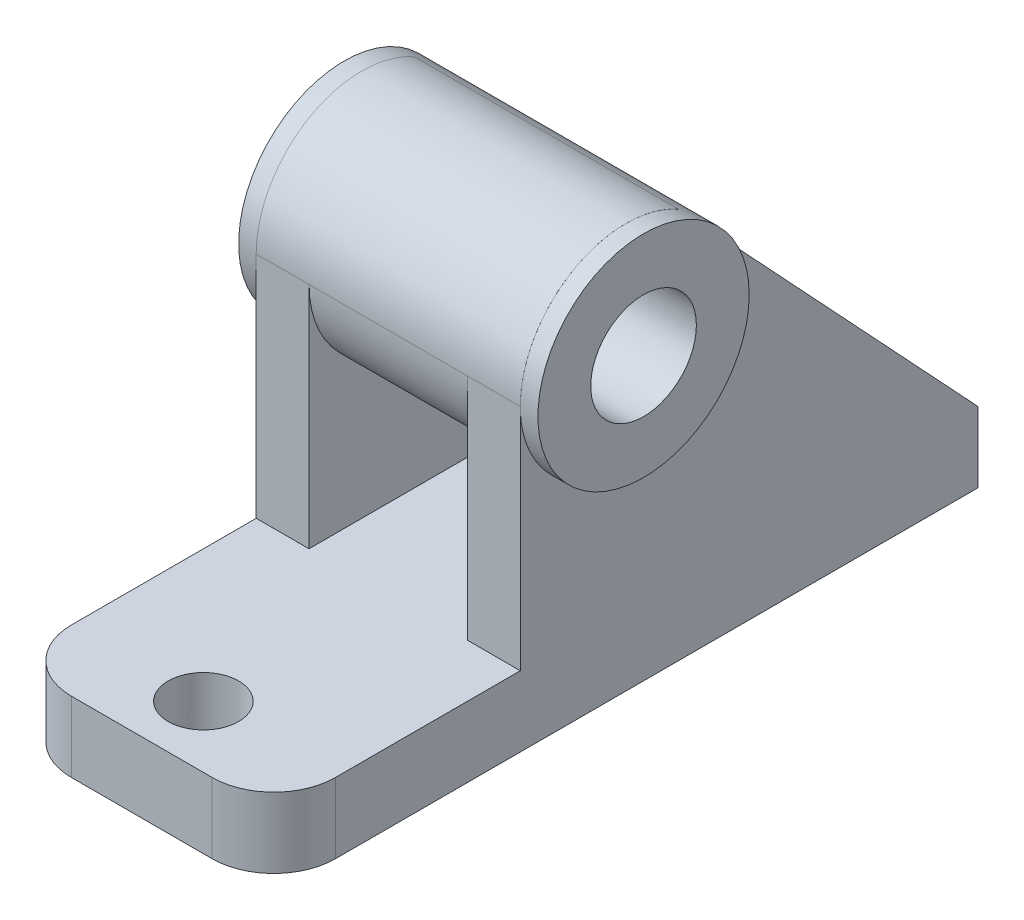
ISO-10303-21;
HEADER;
FILE_DESCRIPTION(('STEP AP214'),'2;1');
FILE_NAME('part.step','',(''),(''),'','','');
FILE_SCHEMA(('AUTOMOTIVE_DESIGN { 1 0 10303 214 1 1 1 1 }'));
ENDSEC;
DATA;
#1=APPLICATION_CONTEXT('core data for automotive mechanical design processes');
#2=APPLICATION_PROTOCOL_DEFINITION('international standard','automotive_design',2000,#1);
#3=PRODUCT_CONTEXT('',#1,'mechanical');
#4=PRODUCT('Part','Part','',(#3));
#5=PRODUCT_RELATED_PRODUCT_CATEGORY('part','',(#4));
#6=PRODUCT_DEFINITION_FORMATION('','',#4);
#7=PRODUCT_DEFINITION_CONTEXT('part definition',#1,'design');
#8=PRODUCT_DEFINITION('design','',#6,#7);
#9=PRODUCT_DEFINITION_SHAPE('','',#8);
#10=(LENGTH_UNIT() NAMED_UNIT(*) SI_UNIT(.MILLI.,.METRE.));
#11=(NAMED_UNIT(*) PLANE_ANGLE_UNIT() SI_UNIT($,.RADIAN.));
#12=(NAMED_UNIT(*) SI_UNIT($,.STERADIAN.) SOLID_ANGLE_UNIT());
#13=UNCERTAINTY_MEASURE_WITH_UNIT(LENGTH_MEASURE(1.E-05),#10,'distance_accuracy_value','');
#14=(GEOMETRIC_REPRESENTATION_CONTEXT(3) GLOBAL_UNCERTAINTY_ASSIGNED_CONTEXT((#13)) GLOBAL_UNIT_ASSIGNED_CONTEXT((#10,
#11,#12)) REPRESENTATION_CONTEXT('',''));
#15=CARTESIAN_POINT('',(0.,0.,0.));
#16=DIRECTION('',(0.,0.,1.));
#17=DIRECTION('',(1.,0.,0.));
#18=AXIS2_PLACEMENT_3D('',#15,#16,#17);
#19=CARTESIAN_POINT('',(-30.,10.4873096446701,-34.010152284264));
#20=DIRECTION('',(0.,0.682658028362796,-0.730737994298791));
#21=DIRECTION('',(0.,0.730737994298791,0.682658028362796));
#22=AXIS2_PLACEMENT_3D('',#19,#20,#21);
#23=PLANE('',#22);
#24=DIRECTION('',(1.,0.,0.));
#25=VECTOR('',#24,1.);
#26=CARTESIAN_POINT('',(-32.,46.8822032427677,-0.00991348459352184));
#27=LINE('',#26,#25);
#28=CARTESIAN_POINT('',(-30.,46.8822032427677,-0.00991348459352748));
#29=VERTEX_POINT('',#28);
#30=CARTESIAN_POINT('',(0.,46.8822032427677,-0.00991348459352705));
#31=VERTEX_POINT('',#30);
#32=EDGE_CURVE('E159',#29,#31,#27,.T.);
#33=ORIENTED_EDGE('',*,*,#32,.F.);
#34=DIRECTION('',(0.,0.730737994298791,0.682658028362796));
#35=VECTOR('',#34,1.);
#36=CARTESIAN_POINT('',(-30.,10.4873096446701,-34.010152284264));
#37=LINE('',#36,#35);
#38=CARTESIAN_POINT('',(-30.,46.8928149393235,0.));
#39=VERTEX_POINT('',#38);
#40=EDGE_CURVE('E236',#29,#39,#37,.T.);
#41=ORIENTED_EDGE('',*,*,#40,.T.);
#42=DIRECTION('',(1.,0.,0.));
#43=VECTOR('',#42,1.);
#44=CARTESIAN_POINT('',(-30.,46.8928149393235,0.));
#45=LINE('',#44,#43);
#46=CARTESIAN_POINT('',(0.,46.8928149393235,0.));
#47=VERTEX_POINT('',#46);
#48=EDGE_CURVE('E162',#39,#47,#45,.T.);
#49=ORIENTED_EDGE('',*,*,#48,.T.);
#50=DIRECTION('',(0.,0.730737994298791,0.682658028362796));
#51=VECTOR('',#50,1.);
#52=CARTESIAN_POINT('',(0.,10.4873096446701,-34.010152284264));
#53=LINE('',#52,#51);
#54=EDGE_CURVE('E157',#31,#47,#53,.T.);
#55=ORIENTED_EDGE('',*,*,#54,.F.);
#56=EDGE_LOOP('',(#33,#41,#49,#55));
#57=FACE_BOUND('',#56,.T.);
#58=ADVANCED_FACE('F37',(#57),#23,.T.);
#59=CARTESIAN_POINT('',(-24.,36.4873096446701,-8.01015228426397));
#60=DIRECTION('',(0.,1.,0.));
#61=DIRECTION('',(0.,0.,1.));
#62=AXIS2_PLACEMENT_3D('',#59,#60,#61);
#63=PLANE('',#62);
#64=DIRECTION('',(0.,0.,1.));
#65=VECTOR('',#64,1.);
#66=CARTESIAN_POINT('',(-24.,36.4873096446701,-8.01015228426397));
#67=LINE('',#66,#65);
#68=CARTESIAN_POINT('',(-24.,36.4873096446701,17.9856004286777));
#69=VERTEX_POINT('',#68);
#70=CARTESIAN_POINT('',(-24.,36.4873096446701,17.989847715736));
#71=VERTEX_POINT('',#70);
#72=EDGE_CURVE('E227',#69,#71,#67,.T.);
#73=ORIENTED_EDGE('',*,*,#72,.F.);
#74=DIRECTION('',(1.,0.,0.));
#75=VECTOR('',#74,1.);
#76=CARTESIAN_POINT('',(-32.,36.4873096446701,17.9856004286777));
#77=LINE('',#76,#75);
#78=CARTESIAN_POINT('',(-6.,36.4873096446701,17.9856004286777));
#79=VERTEX_POINT('',#78);
#80=EDGE_CURVE('E196',#69,#79,#77,.T.);
#81=ORIENTED_EDGE('',*,*,#80,.T.);
#82=DIRECTION('',(0.,0.,1.));
#83=VECTOR('',#82,1.);
#84=CARTESIAN_POINT('',(-6.,36.4873096446701,-8.01015228426397));
#85=LINE('',#84,#83);
#86=CARTESIAN_POINT('',(-6.,36.4873096446701,17.989847715736));
#87=VERTEX_POINT('',#86);
#88=EDGE_CURVE('E59',#79,#87,#85,.T.);
#89=ORIENTED_EDGE('',*,*,#88,.T.);
#90=DIRECTION('',(-1.,0.,0.));
#91=VECTOR('',#90,1.);
#92=CARTESIAN_POINT('',(-24.,36.4873096446701,17.989847715736));
#93=LINE('',#92,#91);
#94=EDGE_CURVE('E219',#87,#71,#93,.T.);
#95=ORIENTED_EDGE('',*,*,#94,.T.);
#96=EDGE_LOOP('',(#73,#81,#89,#95));
#97=FACE_BOUND('',#96,.T.);
#98=ADVANCED_FACE('F347',(#97),#63,.F.);
#99=CARTESIAN_POINT('',(-30.,10.4873096446701,17.989847715736));
#100=DIRECTION('',(0.,0.,1.));
#101=DIRECTION('',(1.,0.,0.));
#102=AXIS2_PLACEMENT_3D('',#99,#100,#101);
#103=PLANE('',#102);
#104=DIRECTION('',(0.,-1.,0.));
#105=VECTOR('',#104,1.);
#106=CARTESIAN_POINT('',(-24.,10.4873096446701,17.989847715736));
#107=LINE('',#106,#105);
#108=CARTESIAN_POINT('',(-24.,10.4873096446701,17.989847715736));
#109=VERTEX_POINT('',#108);
#110=EDGE_CURVE('E208',#71,#109,#107,.T.);
#111=ORIENTED_EDGE('',*,*,#110,.F.);
#112=DIRECTION('',(1.,0.,0.));
#113=VECTOR('',#112,1.);
#114=CARTESIAN_POINT('',(-30.,36.4873096446701,17.989847715736));
#115=LINE('',#114,#113);
#116=CARTESIAN_POINT('',(-30.,36.4873096446701,17.989847715736));
#117=VERTEX_POINT('',#116);
#118=EDGE_CURVE('E252',#117,#71,#115,.T.);
#119=ORIENTED_EDGE('',*,*,#118,.F.);
#120=DIRECTION('',(0.,-1.,0.));
#121=VECTOR('',#120,1.);
#122=CARTESIAN_POINT('',(-30.,10.4873096446701,17.989847715736));
#123=LINE('',#122,#121);
#124=CARTESIAN_POINT('',(-30.,10.4873096446701,17.989847715736));
#125=VERTEX_POINT('',#124);
#126=EDGE_CURVE('E239',#117,#125,#123,.T.);
#127=ORIENTED_EDGE('',*,*,#126,.T.);
#128=DIRECTION('',(1.,0.,0.));
#129=VECTOR('',#128,1.);
#130=CARTESIAN_POINT('',(-30.,10.4873096446701,17.989847715736));
#131=LINE('',#130,#129);
#132=EDGE_CURVE('E247',#125,#109,#131,.T.);
#133=ORIENTED_EDGE('',*,*,#132,.T.);
#134=EDGE_LOOP('',(#111,#119,#127,#133));
#135=FACE_BOUND('',#134,.T.);
#136=ADVANCED_FACE('F352',(#135),#103,.T.);
#137=CARTESIAN_POINT('',(-30.,10.4873096446701,45.989847715736));
#138=DIRECTION('',(0.,0.,1.));
#139=DIRECTION('',(1.,0.,0.));
#140=AXIS2_PLACEMENT_3D('',#137,#138,#139);
#141=PLANE('',#140);
#142=DIRECTION('',(1.,0.,0.));
#143=VECTOR('',#142,1.);
#144=CARTESIAN_POINT('',(-30.,10.4873096446701,45.989847715736));
#145=LINE('',#144,#143);
#146=CARTESIAN_POINT('',(-23.,10.4873096446701,45.989847715736));
#147=VERTEX_POINT('',#146);
#148=CARTESIAN_POINT('',(-7.,10.4873096446701,45.989847715736));
#149=VERTEX_POINT('',#148);
#150=EDGE_CURVE('E269',#147,#149,#145,.T.);
#151=ORIENTED_EDGE('',*,*,#150,.F.);
#152=DIRECTION('',(0.,-1.,0.));
#153=VECTOR('',#152,1.);
#154=CARTESIAN_POINT('',(-23.,2.48730964467005,45.989847715736));
#155=LINE('',#154,#153);
#156=CARTESIAN_POINT('',(-23.,2.48730964467005,45.989847715736));
#157=VERTEX_POINT('',#156);
#158=EDGE_CURVE('E289',#147,#157,#155,.T.);
#159=ORIENTED_EDGE('',*,*,#158,.T.);
#160=DIRECTION('',(1.,0.,0.));
#161=VECTOR('',#160,1.);
#162=CARTESIAN_POINT('',(-30.,2.48730964467005,45.989847715736));
#163=LINE('',#162,#161);
#164=CARTESIAN_POINT('',(-7.,2.48730964467005,45.989847715736));
#165=VERTEX_POINT('',#164);
#166=EDGE_CURVE('E264',#157,#165,#163,.T.);
#167=ORIENTED_EDGE('',*,*,#166,.T.);
#168=DIRECTION('',(0.,-1.,0.));
#169=VECTOR('',#168,1.);
#170=CARTESIAN_POINT('',(-7.,10.4873096446701,45.989847715736));
#171=LINE('',#170,#169);
#172=EDGE_CURVE('E283',#165,#149,#171,.F.);
#173=ORIENTED_EDGE('',*,*,#172,.T.);
#174=EDGE_LOOP('',(#151,#159,#167,#173));
#175=FACE_BOUND('',#174,.T.);
#176=ADVANCED_FACE('F305',(#175),#141,.T.);
#177=CARTESIAN_POINT('',(-30.,10.4873096446701,-34.010152284264));
#178=DIRECTION('',(0.,1.,0.));
#179=DIRECTION('',(0.,0.,1.));
#180=AXIS2_PLACEMENT_3D('',#177,#178,#179);
#181=PLANE('',#180);
#182=CARTESIAN_POINT('',(-15.,10.4873096446701,38.989847715736));
#183=DIRECTION('',(0.,1.,0.));
#184=DIRECTION('',(0.,0.,1.));
#185=AXIS2_PLACEMENT_3D('',#182,#183,#184);
#186=CIRCLE('',#185,4.);
#187=CARTESIAN_POINT('',(-15.,10.4873096446701,42.989847715736));
#188=VERTEX_POINT('',#187);
#189=EDGE_CURVE('E407',#188,#188,#186,.T.);
#190=ORIENTED_EDGE('',*,*,#189,.F.);
#191=EDGE_LOOP('',(#190));
#192=FACE_BOUND('',#191,.T.);
#193=ORIENTED_EDGE('',*,*,#132,.F.);
#194=DIRECTION('',(0.,0.,1.));
#195=VECTOR('',#194,1.);
#196=CARTESIAN_POINT('',(-30.,10.4873096446701,-34.010152284264));
#197=LINE('',#196,#195);
#198=CARTESIAN_POINT('',(-30.,10.4873096446701,38.989847715736));
#199=VERTEX_POINT('',#198);
#200=EDGE_CURVE('E262',#125,#199,#197,.T.);
#201=ORIENTED_EDGE('',*,*,#200,.T.);
#202=CARTESIAN_POINT('',(-23.,10.4873096446701,38.989847715736));
#203=DIRECTION('',(0.,1.,0.));
#204=DIRECTION('',(0.,0.,1.));
#205=AXIS2_PLACEMENT_3D('',#202,#203,#204);
#206=CIRCLE('',#205,7.);
#207=EDGE_CURVE('E45',#199,#147,#206,.T.);
#208=ORIENTED_EDGE('',*,*,#207,.T.);
#209=ORIENTED_EDGE('',*,*,#150,.T.);
#210=CARTESIAN_POINT('',(-7.,10.4873096446701,38.989847715736));
#211=DIRECTION('',(0.,1.,0.));
#212=DIRECTION('',(0.,0.,1.));
#213=AXIS2_PLACEMENT_3D('',#210,#211,#212);
#214=CIRCLE('',#213,7.);
#215=CARTESIAN_POINT('',(0.,10.4873096446701,38.989847715736));
#216=VERTEX_POINT('',#215);
#217=EDGE_CURVE('E286',#149,#216,#214,.T.);
#218=ORIENTED_EDGE('',*,*,#217,.T.);
#219=DIRECTION('',(0.,0.,1.));
#220=VECTOR('',#219,1.);
#221=CARTESIAN_POINT('',(0.,10.4873096446701,-34.010152284264));
#222=LINE('',#221,#220);
#223=CARTESIAN_POINT('',(0.,10.4873096446701,17.989847715736));
#224=VERTEX_POINT('',#223);
#225=EDGE_CURVE('E260',#224,#216,#222,.T.);
#226=ORIENTED_EDGE('',*,*,#225,.F.);
#227=CARTESIAN_POINT('',(-5.99999999999999,10.4873096446701,17.989847715736));
#228=VERTEX_POINT('',#227);
#229=EDGE_CURVE('E251',#228,#224,#131,.T.);
#230=ORIENTED_EDGE('',*,*,#229,.F.);
#231=DIRECTION('',(0.,0.,1.));
#232=VECTOR('',#231,1.);
#233=CARTESIAN_POINT('',(-5.99999999999999,10.4873096446701,-8.01015228426397));
#234=LINE('',#233,#232);
#235=CARTESIAN_POINT('',(-5.99999999999999,10.4873096446701,-8.01015228426397));
#236=VERTEX_POINT('',#235);
#237=EDGE_CURVE('E217',#236,#228,#234,.T.);
#238=ORIENTED_EDGE('',*,*,#237,.F.);
#239=DIRECTION('',(1.,0.,0.));
#240=VECTOR('',#239,1.);
#241=CARTESIAN_POINT('',(-5.99999999999999,10.4873096446701,-8.01015228426397));
#242=LINE('',#241,#240);
#243=CARTESIAN_POINT('',(-24.,10.4873096446701,-8.01015228426397));
#244=VERTEX_POINT('',#243);
#245=EDGE_CURVE('E204',#244,#236,#242,.T.);
#246=ORIENTED_EDGE('',*,*,#245,.F.);
#247=DIRECTION('',(0.,0.,1.));
#248=VECTOR('',#247,1.);
#249=CARTESIAN_POINT('',(-24.,10.4873096446701,-8.01015228426397));
#250=LINE('',#249,#248);
#251=EDGE_CURVE('E168',#244,#109,#250,.T.);
#252=ORIENTED_EDGE('',*,*,#251,.T.);
#253=EDGE_LOOP('',(#193,#201,#208,#209,#218,#226,#230,#238,#246,#252));
#254=FACE_BOUND('',#253,.T.);
#255=ADVANCED_FACE('F299',(#192,#254),#181,.T.);
#256=CARTESIAN_POINT('',(-30.,2.48730964467005,-34.010152284264));
#257=DIRECTION('',(0.,0.,-1.));
#258=DIRECTION('',(0.,1.,0.));
#259=AXIS2_PLACEMENT_3D('',#256,#257,#258);
#260=PLANE('',#259);
#261=DIRECTION('',(0.,1.,0.));
#262=VECTOR('',#261,1.);
#263=CARTESIAN_POINT('',(0.,2.48730964467005,-34.010152284264));
#264=LINE('',#263,#262);
#265=CARTESIAN_POINT('',(0.,2.48730964467005,-34.010152284264));
#266=VERTEX_POINT('',#265);
#267=CARTESIAN_POINT('',(0.,10.4873096446701,-34.010152284264));
#268=VERTEX_POINT('',#267);
#269=EDGE_CURVE('E266',#266,#268,#264,.T.);
#270=ORIENTED_EDGE('',*,*,#269,.F.);
#271=DIRECTION('',(1.,0.,0.));
#272=VECTOR('',#271,1.);
#273=CARTESIAN_POINT('',(-30.,2.48730964467005,-34.010152284264));
#274=LINE('',#273,#272);
#275=CARTESIAN_POINT('',(-30.,2.48730964467005,-34.010152284264));
#276=VERTEX_POINT('',#275);
#277=EDGE_CURVE('E274',#276,#266,#274,.T.);
#278=ORIENTED_EDGE('',*,*,#277,.F.);
#279=DIRECTION('',(0.,1.,0.));
#280=VECTOR('',#279,1.);
#281=CARTESIAN_POINT('',(-30.,2.48730964467005,-34.010152284264));
#282=LINE('',#281,#280);
#283=CARTESIAN_POINT('',(-30.,10.4873096446701,-34.010152284264));
#284=VERTEX_POINT('',#283);
#285=EDGE_CURVE('E259',#276,#284,#282,.T.);
#286=ORIENTED_EDGE('',*,*,#285,.T.);
#287=DIRECTION('',(1.,0.,0.));
#288=VECTOR('',#287,1.);
#289=CARTESIAN_POINT('',(-30.,10.4873096446701,-34.010152284264));
#290=LINE('',#289,#288);
#291=EDGE_CURVE('E272',#284,#268,#290,.T.);
#292=ORIENTED_EDGE('',*,*,#291,.T.);
#293=EDGE_LOOP('',(#270,#278,#286,#292));
#294=FACE_BOUND('',#293,.T.);
#295=ADVANCED_FACE('F320',(#294),#260,.T.);
#296=CARTESIAN_POINT('',(-30.,2.48730964467005,45.989847715736));
#297=DIRECTION('',(0.,-1.,0.));
#298=DIRECTION('',(0.,0.,-1.));
#299=AXIS2_PLACEMENT_3D('',#296,#297,#298);
#300=PLANE('',#299);
#301=CARTESIAN_POINT('',(-15.,2.48730964467005,38.989847715736));
#302=DIRECTION('',(0.,-1.,0.));
#303=DIRECTION('',(0.,0.,-1.));
#304=AXIS2_PLACEMENT_3D('',#301,#302,#303);
#305=CIRCLE('',#304,4.);
#306=CARTESIAN_POINT('',(-15.,2.48730964467005,34.989847715736));
#307=VERTEX_POINT('',#306);
#308=EDGE_CURVE('E404',#307,#307,#305,.F.);
#309=ORIENTED_EDGE('',*,*,#308,.T.);
#310=EDGE_LOOP('',(#309));
#311=FACE_BOUND('',#310,.T.);
#312=ORIENTED_EDGE('',*,*,#166,.F.);
#313=CARTESIAN_POINT('',(-23.,2.48730964467005,38.989847715736));
#314=DIRECTION('',(0.,-1.,0.));
#315=DIRECTION('',(0.,0.,-1.));
#316=AXIS2_PLACEMENT_3D('',#313,#314,#315);
#317=CIRCLE('',#316,7.);
#318=CARTESIAN_POINT('',(-30.,2.48730964467005,38.989847715736));
#319=VERTEX_POINT('',#318);
#320=EDGE_CURVE('E292',#157,#319,#317,.T.);
#321=ORIENTED_EDGE('',*,*,#320,.T.);
#322=DIRECTION('',(0.,0.,-1.));
#323=VECTOR('',#322,1.);
#324=CARTESIAN_POINT('',(-30.,2.48730964467005,45.989847715736));
#325=LINE('',#324,#323);
#326=EDGE_CURVE('E257',#319,#276,#325,.T.);
#327=ORIENTED_EDGE('',*,*,#326,.T.);
#328=ORIENTED_EDGE('',*,*,#277,.T.);
#329=DIRECTION('',(0.,0.,-1.));
#330=VECTOR('',#329,1.);
#331=CARTESIAN_POINT('',(0.,2.48730964467005,45.989847715736));
#332=LINE('',#331,#330);
#333=CARTESIAN_POINT('',(0.,2.48730964467005,38.989847715736));
#334=VERTEX_POINT('',#333);
#335=EDGE_CURVE('E250',#334,#266,#332,.T.);
#336=ORIENTED_EDGE('',*,*,#335,.F.);
#337=CARTESIAN_POINT('',(-7.,2.48730964467005,38.989847715736));
#338=DIRECTION('',(0.,-1.,0.));
#339=DIRECTION('',(0.,0.,-1.));
#340=AXIS2_PLACEMENT_3D('',#337,#338,#339);
#341=CIRCLE('',#340,7.);
#342=EDGE_CURVE('E280',#334,#165,#341,.T.);
#343=ORIENTED_EDGE('',*,*,#342,.T.);
#344=EDGE_LOOP('',(#312,#321,#327,#328,#336,#343));
#345=FACE_BOUND('',#344,.T.);
#346=ADVANCED_FACE('F311',(#311,#345),#300,.T.);
#347=CARTESIAN_POINT('',(-30.,0.,0.));
#348=DIRECTION('',(1.,0.,0.));
#349=DIRECTION('',(0.,0.,-1.));
#350=AXIS2_PLACEMENT_3D('',#347,#348,#349);
#351=PLANE('',#350);
#352=ORIENTED_EDGE('',*,*,#40,.F.);
#353=CARTESIAN_POINT('',(-30.,36.4873096446701,5.98560042867767));
#354=DIRECTION('',(1.,0.,0.));
#355=DIRECTION('',(0.,0.,-1.));
#356=AXIS2_PLACEMENT_3D('',#353,#354,#355);
#357=CIRCLE('',#356,12.);
#358=CARTESIAN_POINT('',(-30.,41.7625681011342,-4.79269480839501));
#359=VERTEX_POINT('',#358);
#360=EDGE_CURVE('E176',#29,#359,#357,.T.);
#361=ORIENTED_EDGE('',*,*,#360,.T.);
#362=EDGE_CURVE('E232',#284,#359,#37,.T.);
#363=ORIENTED_EDGE('',*,*,#362,.F.);
#364=ORIENTED_EDGE('',*,*,#285,.F.);
#365=ORIENTED_EDGE('',*,*,#326,.F.);
#366=DIRECTION('',(0.,-1.,0.));
#367=VECTOR('',#366,1.);
#368=CARTESIAN_POINT('',(-30.,10.4873096446701,38.989847715736));
#369=LINE('',#368,#367);
#370=EDGE_CURVE('E294',#319,#199,#369,.F.);
#371=ORIENTED_EDGE('',*,*,#370,.T.);
#372=ORIENTED_EDGE('',*,*,#200,.F.);
#373=ORIENTED_EDGE('',*,*,#126,.F.);
#374=CARTESIAN_POINT('',(-30.,36.4873096446701,5.98560042867767));
#375=DIRECTION('',(1.,0.,0.));
#376=DIRECTION('',(0.,0.,1.));
#377=AXIS2_PLACEMENT_3D('',#374,#375,#376);
#378=CIRCLE('',#377,12.0042472870584);
#379=EDGE_CURVE('E235',#39,#117,#378,.T.);
#380=ORIENTED_EDGE('',*,*,#379,.F.);
#381=EDGE_LOOP('',(#352,#361,#363,#364,#365,#371,#372,#373,#380));
#382=FACE_BOUND('',#381,.T.);
#383=ADVANCED_FACE('F315',(#382),#351,.F.);
#384=CARTESIAN_POINT('',(0.,0.,0.));
#385=DIRECTION('',(1.,0.,0.));
#386=DIRECTION('',(0.,0.,-1.));
#387=AXIS2_PLACEMENT_3D('',#384,#385,#386);
#388=PLANE('',#387);
#389=CARTESIAN_POINT('',(0.,41.7625681011342,-4.792694808395));
#390=VERTEX_POINT('',#389);
#391=EDGE_CURVE('E167',#268,#390,#53,.T.);
#392=ORIENTED_EDGE('',*,*,#391,.T.);
#393=CARTESIAN_POINT('',(0.,36.4873096446701,5.98560042867767));
#394=DIRECTION('',(1.,0.,0.));
#395=DIRECTION('',(0.,0.,-1.));
#396=AXIS2_PLACEMENT_3D('',#393,#394,#395);
#397=CIRCLE('',#396,12.);
#398=EDGE_CURVE('E174',#31,#390,#397,.T.);
#399=ORIENTED_EDGE('',*,*,#398,.F.);
#400=ORIENTED_EDGE('',*,*,#54,.T.);
#401=CARTESIAN_POINT('',(0.,36.4873096446701,5.98560042867767));
#402=DIRECTION('',(1.,0.,0.));
#403=DIRECTION('',(0.,0.,1.));
#404=AXIS2_PLACEMENT_3D('',#401,#402,#403);
#405=CIRCLE('',#404,12.0042472870584);
#406=CARTESIAN_POINT('',(0.,36.4873096446701,17.989847715736));
#407=VERTEX_POINT('',#406);
#408=EDGE_CURVE('E242',#47,#407,#405,.T.);
#409=ORIENTED_EDGE('',*,*,#408,.T.);
#410=DIRECTION('',(0.,-1.,0.));
#411=VECTOR('',#410,1.);
#412=CARTESIAN_POINT('',(0.,10.4873096446701,17.989847715736));
#413=LINE('',#412,#411);
#414=EDGE_CURVE('E244',#407,#224,#413,.T.);
#415=ORIENTED_EDGE('',*,*,#414,.T.);
#416=ORIENTED_EDGE('',*,*,#225,.T.);
#417=DIRECTION('',(0.,-1.,0.));
#418=VECTOR('',#417,1.);
#419=CARTESIAN_POINT('',(0.,0.,38.989847715736));
#420=LINE('',#419,#418);
#421=EDGE_CURVE('E271',#216,#334,#420,.T.);
#422=ORIENTED_EDGE('',*,*,#421,.T.);
#423=ORIENTED_EDGE('',*,*,#335,.T.);
#424=ORIENTED_EDGE('',*,*,#269,.T.);
#425=EDGE_LOOP('',(#392,#399,#400,#409,#415,#416,#422,#423,#424));
#426=FACE_BOUND('',#425,.T.);
#427=ADVANCED_FACE('F180',(#426),#388,.T.);
#428=CARTESIAN_POINT('',(-7.,0.,38.989847715736));
#429=DIRECTION('',(0.,-1.,0.));
#430=DIRECTION('',(0.,0.,-1.));
#431=AXIS2_PLACEMENT_3D('',#428,#429,#430);
#432=CYLINDRICAL_SURFACE('',#431,7.);
#433=ORIENTED_EDGE('',*,*,#217,.F.);
#434=ORIENTED_EDGE('',*,*,#172,.F.);
#435=ORIENTED_EDGE('',*,*,#342,.F.);
#436=ORIENTED_EDGE('',*,*,#421,.F.);
#437=EDGE_LOOP('',(#433,#434,#435,#436));
#438=FACE_BOUND('',#437,.T.);
#439=ADVANCED_FACE('F338',(#438),#432,.T.);
#440=CARTESIAN_POINT('',(-23.,10.4873096446701,38.989847715736));
#441=DIRECTION('',(0.,1.,0.));
#442=DIRECTION('',(0.,0.,1.));
#443=AXIS2_PLACEMENT_3D('',#440,#441,#442);
#444=CYLINDRICAL_SURFACE('',#443,7.);
#445=ORIENTED_EDGE('',*,*,#207,.F.);
#446=ORIENTED_EDGE('',*,*,#370,.F.);
#447=ORIENTED_EDGE('',*,*,#320,.F.);
#448=ORIENTED_EDGE('',*,*,#158,.F.);
#449=EDGE_LOOP('',(#445,#446,#447,#448));
#450=FACE_BOUND('',#449,.T.);
#451=ADVANCED_FACE('F39',(#450),#444,.T.);
#452=DIRECTION('',(0.,1.,0.));
#453=VECTOR('',#452,1.);
#454=CARTESIAN_POINT('',(-6.,36.4873096446701,17.989847715736));
#455=LINE('',#454,#453);
#456=EDGE_CURVE('E177',#228,#87,#455,.T.);
#457=ORIENTED_EDGE('',*,*,#456,.F.);
#458=ORIENTED_EDGE('',*,*,#229,.T.);
#459=ORIENTED_EDGE('',*,*,#414,.F.);
#460=EDGE_CURVE('E255',#87,#407,#115,.T.);
#461=ORIENTED_EDGE('',*,*,#460,.F.);
#462=EDGE_LOOP('',(#457,#458,#459,#461));
#463=FACE_BOUND('',#462,.T.);
#464=ADVANCED_FACE('F332',(#463),#103,.T.);
#465=CARTESIAN_POINT('',(-30.,36.4873096446701,5.98560042867767));
#466=DIRECTION('',(1.,0.,0.));
#467=DIRECTION('',(0.,0.,-1.));
#468=AXIS2_PLACEMENT_3D('',#465,#466,#467);
#469=CYLINDRICAL_SURFACE('',#468,12.0042472870584);
#470=ORIENTED_EDGE('',*,*,#408,.F.);
#471=ORIENTED_EDGE('',*,*,#48,.F.);
#472=ORIENTED_EDGE('',*,*,#379,.T.);
#473=ORIENTED_EDGE('',*,*,#118,.T.);
#474=ORIENTED_EDGE('',*,*,#94,.F.);
#475=ORIENTED_EDGE('',*,*,#460,.T.);
#476=EDGE_LOOP('',(#470,#471,#472,#473,#474,#475));
#477=FACE_BOUND('',#476,.T.);
#478=ADVANCED_FACE('F326',(#477),#469,.T.);
#479=DIRECTION('',(1.,0.,0.));
#480=VECTOR('',#479,1.);
#481=CARTESIAN_POINT('',(-32.,41.7625681011342,-4.79269480839501));
#482=LINE('',#481,#480);
#483=EDGE_CURVE('E201',#390,#359,#482,.F.);
#484=ORIENTED_EDGE('',*,*,#483,.F.);
#485=ORIENTED_EDGE('',*,*,#391,.F.);
#486=ORIENTED_EDGE('',*,*,#291,.F.);
#487=ORIENTED_EDGE('',*,*,#362,.T.);
#488=EDGE_LOOP('',(#484,#485,#486,#487));
#489=FACE_BOUND('',#488,.T.);
#490=ADVANCED_FACE('F322',(#489),#23,.T.);
#491=CARTESIAN_POINT('',(-24.,10.4873096446701,-8.01015228426397));
#492=DIRECTION('',(-1.,0.,0.));
#493=DIRECTION('',(0.,0.,1.));
#494=AXIS2_PLACEMENT_3D('',#491,#492,#493);
#495=PLANE('',#494);
#496=CARTESIAN_POINT('',(-24.,36.4873096446701,-8.01015228426397));
#497=VERTEX_POINT('',#496);
#498=CARTESIAN_POINT('',(-24.,36.4873096446701,-6.01439957132233));
#499=VERTEX_POINT('',#498);
#500=EDGE_CURVE('E224',#497,#499,#67,.T.);
#501=ORIENTED_EDGE('',*,*,#500,.T.);
#502=CARTESIAN_POINT('',(-24.,36.4873096446701,5.98560042867767));
#503=DIRECTION('',(-1.,0.,0.));
#504=DIRECTION('',(0.,0.,1.));
#505=AXIS2_PLACEMENT_3D('',#502,#503,#504);
#506=CIRCLE('',#505,12.);
#507=EDGE_CURVE('E198',#499,#69,#506,.T.);
#508=ORIENTED_EDGE('',*,*,#507,.T.);
#509=ORIENTED_EDGE('',*,*,#72,.T.);
#510=ORIENTED_EDGE('',*,*,#110,.T.);
#511=ORIENTED_EDGE('',*,*,#251,.F.);
#512=DIRECTION('',(0.,-1.,0.));
#513=VECTOR('',#512,1.);
#514=CARTESIAN_POINT('',(-24.,10.4873096446701,-8.01015228426397));
#515=LINE('',#514,#513);
#516=EDGE_CURVE('E214',#497,#244,#515,.T.);
#517=ORIENTED_EDGE('',*,*,#516,.F.);
#518=EDGE_LOOP('',(#501,#508,#509,#510,#511,#517));
#519=FACE_BOUND('',#518,.T.);
#520=ADVANCED_FACE('F358',(#519),#495,.F.);
#521=CARTESIAN_POINT('',(-6.,36.4873096446701,-8.01015228426397));
#522=VERTEX_POINT('',#521);
#523=CARTESIAN_POINT('',(-6.,36.4873096446701,-6.01439957132233));
#524=VERTEX_POINT('',#523);
#525=EDGE_CURVE('E228',#522,#524,#85,.T.);
#526=ORIENTED_EDGE('',*,*,#525,.T.);
#527=DIRECTION('',(1.,0.,0.));
#528=VECTOR('',#527,1.);
#529=CARTESIAN_POINT('',(-32.,36.4873096446701,-6.01439957132233));
#530=LINE('',#529,#528);
#531=EDGE_CURVE('E52',#524,#499,#530,.F.);
#532=ORIENTED_EDGE('',*,*,#531,.T.);
#533=ORIENTED_EDGE('',*,*,#500,.F.);
#534=DIRECTION('',(-1.,0.,0.));
#535=VECTOR('',#534,1.);
#536=CARTESIAN_POINT('',(-24.,36.4873096446701,-8.01015228426397));
#537=LINE('',#536,#535);
#538=EDGE_CURVE('E211',#522,#497,#537,.T.);
#539=ORIENTED_EDGE('',*,*,#538,.F.);
#540=EDGE_LOOP('',(#526,#532,#533,#539));
#541=FACE_BOUND('',#540,.T.);
#542=ADVANCED_FACE('F354',(#541),#63,.F.);
#543=CARTESIAN_POINT('',(-6.,36.4873096446701,-8.01015228426397));
#544=DIRECTION('',(1.,0.,0.));
#545=DIRECTION('',(0.,1.,0.));
#546=AXIS2_PLACEMENT_3D('',#543,#544,#545);
#547=PLANE('',#546);
#548=ORIENTED_EDGE('',*,*,#88,.F.);
#549=CARTESIAN_POINT('',(-6.,36.4873096446701,5.98560042867767));
#550=DIRECTION('',(1.,0.,0.));
#551=DIRECTION('',(0.,1.,0.));
#552=AXIS2_PLACEMENT_3D('',#549,#550,#551);
#553=CIRCLE('',#552,12.);
#554=EDGE_CURVE('E11',#79,#524,#553,.T.);
#555=ORIENTED_EDGE('',*,*,#554,.T.);
#556=ORIENTED_EDGE('',*,*,#525,.F.);
#557=DIRECTION('',(0.,1.,0.));
#558=VECTOR('',#557,1.);
#559=CARTESIAN_POINT('',(-6.,36.4873096446701,-8.01015228426397));
#560=LINE('',#559,#558);
#561=EDGE_CURVE('E207',#236,#522,#560,.T.);
#562=ORIENTED_EDGE('',*,*,#561,.F.);
#563=ORIENTED_EDGE('',*,*,#237,.T.);
#564=ORIENTED_EDGE('',*,*,#456,.T.);
#565=EDGE_LOOP('',(#548,#555,#556,#562,#563,#564));
#566=FACE_BOUND('',#565,.T.);
#567=ADVANCED_FACE('F370',(#566),#547,.F.);
#568=CARTESIAN_POINT('',(0.,0.,-8.01015228426397));
#569=DIRECTION('',(0.,0.,-1.));
#570=DIRECTION('',(-1.,0.,0.));
#571=AXIS2_PLACEMENT_3D('',#568,#569,#570);
#572=PLANE('',#571);
#573=ORIENTED_EDGE('',*,*,#245,.T.);
#574=ORIENTED_EDGE('',*,*,#561,.T.);
#575=ORIENTED_EDGE('',*,*,#538,.T.);
#576=ORIENTED_EDGE('',*,*,#516,.T.);
#577=EDGE_LOOP('',(#573,#574,#575,#576));
#578=FACE_BOUND('',#577,.T.);
#579=ADVANCED_FACE('F372',(#578),#572,.F.);
#580=CARTESIAN_POINT('',(-32.,36.4873096446701,5.98560042867767));
#581=DIRECTION('',(1.,0.,0.));
#582=DIRECTION('',(0.,0.,-1.));
#583=AXIS2_PLACEMENT_3D('',#580,#581,#582);
#584=CYLINDRICAL_SURFACE('',#583,12.);
#585=ORIENTED_EDGE('',*,*,#507,.F.);
#586=ORIENTED_EDGE('',*,*,#531,.F.);
#587=ORIENTED_EDGE('',*,*,#554,.F.);
#588=ORIENTED_EDGE('',*,*,#80,.F.);
#589=EDGE_LOOP('',(#585,#586,#587,#588));
#590=FACE_BOUND('',#589,.T.);
#591=ADVANCED_FACE('F379',(#590),#584,.T.);
#592=CARTESIAN_POINT('',(-32.,36.4873096446701,5.98560042867767));
#593=DIRECTION('',(1.,0.,0.));
#594=DIRECTION('',(0.,0.,-1.));
#595=AXIS2_PLACEMENT_3D('',#592,#593,#594);
#596=CIRCLE('',#595,12.);
#597=CARTESIAN_POINT('',(-32.,36.4873096446701,-6.01439957132233));
#598=VERTEX_POINT('',#597);
#599=EDGE_CURVE('E187',#598,#598,#596,.T.);
#600=ORIENTED_EDGE('',*,*,#599,.T.);
#601=EDGE_LOOP('',(#600));
#602=FACE_BOUND('',#601,.T.);
#603=ORIENTED_EDGE('',*,*,#360,.F.);
#604=ORIENTED_EDGE('',*,*,#32,.T.);
#605=ORIENTED_EDGE('',*,*,#398,.T.);
#606=ORIENTED_EDGE('',*,*,#483,.T.);
#607=EDGE_LOOP('',(#603,#604,#605,#606));
#608=FACE_BOUND('',#607,.T.);
#609=CARTESIAN_POINT('',(2.,36.4873096446701,5.98560042867767));
#610=DIRECTION('',(1.,0.,0.));
#611=DIRECTION('',(0.,0.,-1.));
#612=AXIS2_PLACEMENT_3D('',#609,#610,#611);
#613=CIRCLE('',#612,12.);
#614=CARTESIAN_POINT('',(2.,36.4873096446701,-6.01439957132233));
#615=VERTEX_POINT('',#614);
#616=EDGE_CURVE('E183',#615,#615,#613,.T.);
#617=ORIENTED_EDGE('',*,*,#616,.F.);
#618=EDGE_LOOP('',(#617));
#619=FACE_BOUND('',#618,.T.);
#620=ADVANCED_FACE('F172',(#602,#608,#619),#584,.T.);
#621=CARTESIAN_POINT('',(-32.,36.4873096446701,5.98560042867767));
#622=DIRECTION('',(1.,0.,0.));
#623=DIRECTION('',(0.,0.,-1.));
#624=AXIS2_PLACEMENT_3D('',#621,#622,#623);
#625=PLANE('',#624);
#626=CARTESIAN_POINT('',(-32.,36.4873096446701,5.98560042867767));
#627=DIRECTION('',(1.,0.,0.));
#628=DIRECTION('',(0.,0.,-1.));
#629=AXIS2_PLACEMENT_3D('',#626,#627,#628);
#630=CIRCLE('',#629,6.);
#631=CARTESIAN_POINT('',(-32.,36.4873096446701,-0.0143995713223297));
#632=VERTEX_POINT('',#631);
#633=EDGE_CURVE('E184',#632,#632,#630,.F.);
#634=ORIENTED_EDGE('',*,*,#633,.F.);
#635=EDGE_LOOP('',(#634));
#636=FACE_BOUND('',#635,.T.);
#637=ORIENTED_EDGE('',*,*,#599,.F.);
#638=EDGE_LOOP('',(#637));
#639=FACE_BOUND('',#638,.T.);
#640=ADVANCED_FACE('F383',(#636,#639),#625,.F.);
#641=CARTESIAN_POINT('',(2.,36.4873096446701,5.98560042867767));
#642=DIRECTION('',(1.,0.,0.));
#643=DIRECTION('',(0.,0.,-1.));
#644=AXIS2_PLACEMENT_3D('',#641,#642,#643);
#645=PLANE('',#644);
#646=CARTESIAN_POINT('',(2.,36.4873096446701,5.98560042867767));
#647=DIRECTION('',(1.,0.,0.));
#648=DIRECTION('',(0.,0.,-1.));
#649=AXIS2_PLACEMENT_3D('',#646,#647,#648);
#650=CIRCLE('',#649,6.);
#651=CARTESIAN_POINT('',(2.,36.4873096446701,-0.0143995713223297));
#652=VERTEX_POINT('',#651);
#653=EDGE_CURVE('E190',#652,#652,#650,.T.);
#654=ORIENTED_EDGE('',*,*,#653,.F.);
#655=EDGE_LOOP('',(#654));
#656=FACE_BOUND('',#655,.T.);
#657=ORIENTED_EDGE('',*,*,#616,.T.);
#658=EDGE_LOOP('',(#657));
#659=FACE_BOUND('',#658,.T.);
#660=ADVANCED_FACE('F387',(#656,#659),#645,.T.);
#661=CARTESIAN_POINT('',(-32.001,36.4873096446701,5.98560042867767));
#662=DIRECTION('',(1.,0.,0.));
#663=DIRECTION('',(0.,0.,-1.));
#664=AXIS2_PLACEMENT_3D('',#661,#662,#663);
#665=CYLINDRICAL_SURFACE('',#664,6.);
#666=ORIENTED_EDGE('',*,*,#653,.T.);
#667=EDGE_LOOP('',(#666));
#668=FACE_BOUND('',#667,.T.);
#669=ORIENTED_EDGE('',*,*,#633,.T.);
#670=EDGE_LOOP('',(#669));
#671=FACE_BOUND('',#670,.T.);
#672=ADVANCED_FACE('F391',(#668,#671),#665,.F.);
#673=CARTESIAN_POINT('',(-15.,2.48630964467004,38.989847715736));
#674=DIRECTION('',(0.,1.,0.));
#675=DIRECTION('',(0.,0.,1.));
#676=AXIS2_PLACEMENT_3D('',#673,#674,#675);
#677=CYLINDRICAL_SURFACE('',#676,4.);
#678=ORIENTED_EDGE('',*,*,#308,.F.);
#679=EDGE_LOOP('',(#678));
#680=FACE_BOUND('',#679,.T.);
#681=ORIENTED_EDGE('',*,*,#189,.T.);
#682=EDGE_LOOP('',(#681));
#683=FACE_BOUND('',#682,.T.);
#684=ADVANCED_FACE('F395',(#680,#683),#677,.F.);
#685=CLOSED_SHELL('',(#58,#98,#136,#176,#255,#295,#346,#383,#427,#439,#451,#464,#478,#490,#520,
#542,#567,#579,#591,#620,#640,#660,#672,#684));
#686=MANIFOLD_SOLID_BREP('B2',#685);
#687=ADVANCED_BREP_SHAPE_REPRESENTATION('',(#18,#686),#14);
#688=SHAPE_DEFINITION_REPRESENTATION(#9,#687);
ENDSEC;
END-ISO-10303-21;
